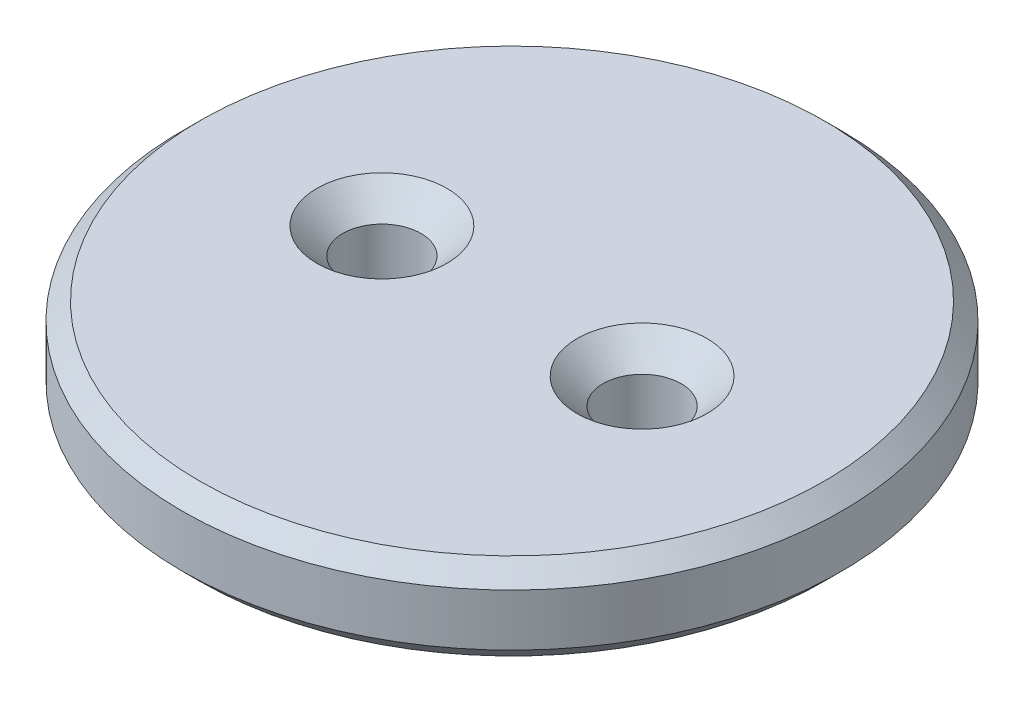
ISO-10303-21;
HEADER;
FILE_DESCRIPTION(('STEP AP214'),'2;1');
FILE_NAME('part.step','',(''),(''),'','','');
FILE_SCHEMA(('AUTOMOTIVE_DESIGN { 1 0 10303 214 1 1 1 1 }'));
ENDSEC;
DATA;
#1=APPLICATION_CONTEXT('core data for automotive mechanical design processes');
#2=APPLICATION_PROTOCOL_DEFINITION('international standard','automotive_design',2000,#1);
#3=PRODUCT_CONTEXT('',#1,'mechanical');
#4=PRODUCT('Part','Part','',(#3));
#5=PRODUCT_RELATED_PRODUCT_CATEGORY('part','',(#4));
#6=PRODUCT_DEFINITION_FORMATION('','',#4);
#7=PRODUCT_DEFINITION_CONTEXT('part definition',#1,'design');
#8=PRODUCT_DEFINITION('design','',#6,#7);
#9=PRODUCT_DEFINITION_SHAPE('','',#8);
#10=(LENGTH_UNIT() NAMED_UNIT(*) SI_UNIT(.MILLI.,.METRE.));
#11=(NAMED_UNIT(*) PLANE_ANGLE_UNIT() SI_UNIT($,.RADIAN.));
#12=(NAMED_UNIT(*) SI_UNIT($,.STERADIAN.) SOLID_ANGLE_UNIT());
#13=UNCERTAINTY_MEASURE_WITH_UNIT(LENGTH_MEASURE(1.E-05),#10,'distance_accuracy_value','');
#14=(GEOMETRIC_REPRESENTATION_CONTEXT(3) GLOBAL_UNCERTAINTY_ASSIGNED_CONTEXT((#13)) GLOBAL_UNIT_ASSIGNED_CONTEXT((#10,
#11,#12)) REPRESENTATION_CONTEXT('',''));
#15=CARTESIAN_POINT('',(0.,0.,0.));
#16=DIRECTION('',(0.,0.,1.));
#17=DIRECTION('',(1.,0.,0.));
#18=AXIS2_PLACEMENT_3D('',#15,#16,#17);
#19=CARTESIAN_POINT('',(0.,0.,0.));
#20=DIRECTION('',(0.,1.,0.));
#21=DIRECTION('',(0.,0.,1.));
#22=AXIS2_PLACEMENT_3D('',#19,#20,#21);
#23=PLANE('',#22);
#24=CARTESIAN_POINT('',(0.,0.,0.));
#25=DIRECTION('',(0.,1.,0.));
#26=DIRECTION('',(0.,0.,1.));
#27=AXIS2_PLACEMENT_3D('',#24,#25,#26);
#28=CIRCLE('',#27,18.);
#29=CARTESIAN_POINT('',(0.,0.,18.));
#30=VERTEX_POINT('',#29);
#31=EDGE_CURVE('E123',#30,#30,#28,.F.);
#32=ORIENTED_EDGE('',*,*,#31,.T.);
#33=EDGE_LOOP('',(#32));
#34=FACE_BOUND('',#33,.T.);
#35=DIRECTION('',(0.,0.,1.));
#36=VECTOR('',#35,1.);
#37=CARTESIAN_POINT('',(12.5,0.,-6.5));
#38=LINE('',#37,#36);
#39=CARTESIAN_POINT('',(12.5,0.,-6.5));
#40=VERTEX_POINT('',#39);
#41=CARTESIAN_POINT('',(12.5,0.,6.5));
#42=VERTEX_POINT('',#41);
#43=EDGE_CURVE('E107',#40,#42,#38,.T.);
#44=ORIENTED_EDGE('',*,*,#43,.F.);
#45=DIRECTION('',(1.,0.,0.));
#46=VECTOR('',#45,1.);
#47=CARTESIAN_POINT('',(-12.5,0.,-6.5));
#48=LINE('',#47,#46);
#49=CARTESIAN_POINT('',(-12.5,0.,-6.5));
#50=VERTEX_POINT('',#49);
#51=EDGE_CURVE('E104',#50,#40,#48,.T.);
#52=ORIENTED_EDGE('',*,*,#51,.F.);
#53=DIRECTION('',(0.,0.,-1.));
#54=VECTOR('',#53,1.);
#55=CARTESIAN_POINT('',(-12.5,0.,-6.5));
#56=LINE('',#55,#54);
#57=CARTESIAN_POINT('',(-12.5,0.,6.5));
#58=VERTEX_POINT('',#57);
#59=EDGE_CURVE('E64',#58,#50,#56,.T.);
#60=ORIENTED_EDGE('',*,*,#59,.F.);
#61=DIRECTION('',(-1.,0.,0.));
#62=VECTOR('',#61,1.);
#63=CARTESIAN_POINT('',(-12.5,0.,6.5));
#64=LINE('',#63,#62);
#65=EDGE_CURVE('E59',#42,#58,#64,.T.);
#66=ORIENTED_EDGE('',*,*,#65,.F.);
#67=EDGE_LOOP('',(#44,#52,#60,#66));
#68=FACE_BOUND('',#67,.T.);
#69=ADVANCED_FACE('F42',(#34,#68),#23,.F.);
#70=CARTESIAN_POINT('',(0.,5.,0.));
#71=DIRECTION('',(0.,-1.,0.));
#72=DIRECTION('',(0.,0.,-1.));
#73=AXIS2_PLACEMENT_3D('',#70,#71,#72);
#74=CYLINDRICAL_SURFACE('',#73,19.);
#75=CARTESIAN_POINT('',(0.,1.00000000000001,0.));
#76=DIRECTION('',(0.,1.,0.));
#77=DIRECTION('',(0.,0.,1.));
#78=AXIS2_PLACEMENT_3D('',#75,#76,#77);
#79=CIRCLE('',#78,19.);
#80=CARTESIAN_POINT('',(0.,1.00000000000001,19.));
#81=VERTEX_POINT('',#80);
#82=EDGE_CURVE('E114',#81,#81,#79,.T.);
#83=ORIENTED_EDGE('',*,*,#82,.T.);
#84=EDGE_LOOP('',(#83));
#85=FACE_BOUND('',#84,.T.);
#86=CARTESIAN_POINT('',(0.,4.,0.));
#87=DIRECTION('',(0.,1.,0.));
#88=DIRECTION('',(0.,0.,1.));
#89=AXIS2_PLACEMENT_3D('',#86,#87,#88);
#90=CIRCLE('',#89,19.);
#91=CARTESIAN_POINT('',(0.,4.,19.));
#92=VERTEX_POINT('',#91);
#93=EDGE_CURVE('E109',#92,#92,#90,.F.);
#94=ORIENTED_EDGE('',*,*,#93,.T.);
#95=EDGE_LOOP('',(#94));
#96=FACE_BOUND('',#95,.T.);
#97=ADVANCED_FACE('F198',(#85,#96),#74,.T.);
#98=CARTESIAN_POINT('',(0.,5.,0.));
#99=DIRECTION('',(0.,1.,0.));
#100=DIRECTION('',(0.,0.,1.));
#101=AXIS2_PLACEMENT_3D('',#98,#99,#100);
#102=PLANE('',#101);
#103=CARTESIAN_POINT('',(7.5,5.,0.));
#104=DIRECTION('',(0.,1.,0.));
#105=DIRECTION('',(0.,0.,1.));
#106=AXIS2_PLACEMENT_3D('',#103,#104,#105);
#107=CIRCLE('',#106,3.75);
#108=CARTESIAN_POINT('',(7.5,5.,3.75));
#109=VERTEX_POINT('',#108);
#110=EDGE_CURVE('E52',#109,#109,#107,.F.);
#111=ORIENTED_EDGE('',*,*,#110,.T.);
#112=EDGE_LOOP('',(#111));
#113=FACE_BOUND('',#112,.T.);
#114=CARTESIAN_POINT('',(-7.5,5.,0.));
#115=DIRECTION('',(0.,1.,0.));
#116=DIRECTION('',(0.,0.,1.));
#117=AXIS2_PLACEMENT_3D('',#114,#115,#116);
#118=CIRCLE('',#117,3.75);
#119=CARTESIAN_POINT('',(-7.5,5.,3.75));
#120=VERTEX_POINT('',#119);
#121=EDGE_CURVE('E135',#120,#120,#118,.F.);
#122=ORIENTED_EDGE('',*,*,#121,.T.);
#123=EDGE_LOOP('',(#122));
#124=FACE_BOUND('',#123,.T.);
#125=CARTESIAN_POINT('',(0.,5.,0.));
#126=DIRECTION('',(0.,1.,0.));
#127=DIRECTION('',(0.,0.,1.));
#128=AXIS2_PLACEMENT_3D('',#125,#126,#127);
#129=CIRCLE('',#128,18.);
#130=CARTESIAN_POINT('',(0.,5.,18.));
#131=VERTEX_POINT('',#130);
#132=EDGE_CURVE('E127',#131,#131,#129,.T.);
#133=ORIENTED_EDGE('',*,*,#132,.T.);
#134=EDGE_LOOP('',(#133));
#135=FACE_BOUND('',#134,.T.);
#136=ADVANCED_FACE('F142',(#113,#124,#135),#102,.T.);
#137=CARTESIAN_POINT('',(0.,1.00000000000001,0.));
#138=DIRECTION('',(0.,1.,0.));
#139=DIRECTION('',(0.,0.,1.));
#140=AXIS2_PLACEMENT_3D('',#137,#138,#139);
#141=CONICAL_SURFACE('',#140,19.,0.78539816339745);
#142=ORIENTED_EDGE('',*,*,#31,.F.);
#143=EDGE_LOOP('',(#142));
#144=FACE_BOUND('',#143,.T.);
#145=ORIENTED_EDGE('',*,*,#82,.F.);
#146=EDGE_LOOP('',(#145));
#147=FACE_BOUND('',#146,.T.);
#148=ADVANCED_FACE('F209',(#144,#147),#141,.T.);
#149=CARTESIAN_POINT('',(0.,5.,0.));
#150=DIRECTION('',(0.,-1.,0.));
#151=DIRECTION('',(0.,0.,-1.));
#152=AXIS2_PLACEMENT_3D('',#149,#150,#151);
#153=CONICAL_SURFACE('',#152,18.,0.78539816339745);
#154=ORIENTED_EDGE('',*,*,#93,.F.);
#155=EDGE_LOOP('',(#154));
#156=FACE_BOUND('',#155,.T.);
#157=ORIENTED_EDGE('',*,*,#132,.F.);
#158=EDGE_LOOP('',(#157));
#159=FACE_BOUND('',#158,.T.);
#160=ADVANCED_FACE('F154',(#156,#159),#153,.T.);
#161=CARTESIAN_POINT('',(7.5,0.,0.));
#162=DIRECTION('',(0.,1.,0.));
#163=DIRECTION('',(0.,0.,1.));
#164=AXIS2_PLACEMENT_3D('',#161,#162,#163);
#165=CYLINDRICAL_SURFACE('',#164,2.25);
#166=CARTESIAN_POINT('',(7.5,3.5,0.));
#167=DIRECTION('',(0.,1.,0.));
#168=DIRECTION('',(0.,0.,1.));
#169=AXIS2_PLACEMENT_3D('',#166,#167,#168);
#170=CIRCLE('',#169,2.25);
#171=CARTESIAN_POINT('',(7.5,3.5,2.25));
#172=VERTEX_POINT('',#171);
#173=EDGE_CURVE('E131',#172,#172,#170,.T.);
#174=ORIENTED_EDGE('',*,*,#173,.T.);
#175=EDGE_LOOP('',(#174));
#176=FACE_BOUND('',#175,.T.);
#177=CARTESIAN_POINT('',(7.5,-2.,0.));
#178=DIRECTION('',(0.,1.,0.));
#179=DIRECTION('',(0.,0.,1.));
#180=AXIS2_PLACEMENT_3D('',#177,#178,#179);
#181=CIRCLE('',#180,2.25);
#182=CARTESIAN_POINT('',(7.5,-2.,2.25));
#183=VERTEX_POINT('',#182);
#184=EDGE_CURVE('E158',#183,#183,#181,.T.);
#185=ORIENTED_EDGE('',*,*,#184,.F.);
#186=EDGE_LOOP('',(#185));
#187=FACE_BOUND('',#186,.T.);
#188=ADVANCED_FACE('F151',(#176,#187),#165,.F.);
#189=CARTESIAN_POINT('',(-7.5,0.,0.));
#190=DIRECTION('',(0.,1.,0.));
#191=DIRECTION('',(0.,0.,1.));
#192=AXIS2_PLACEMENT_3D('',#189,#190,#191);
#193=CYLINDRICAL_SURFACE('',#192,2.25);
#194=CARTESIAN_POINT('',(-7.5,3.5,0.));
#195=DIRECTION('',(0.,1.,0.));
#196=DIRECTION('',(0.,0.,1.));
#197=AXIS2_PLACEMENT_3D('',#194,#195,#196);
#198=CIRCLE('',#197,2.25);
#199=CARTESIAN_POINT('',(-7.5,3.5,2.25));
#200=VERTEX_POINT('',#199);
#201=EDGE_CURVE('E12',#200,#200,#198,.T.);
#202=ORIENTED_EDGE('',*,*,#201,.T.);
#203=EDGE_LOOP('',(#202));
#204=FACE_BOUND('',#203,.T.);
#205=CARTESIAN_POINT('',(-7.5,-2.,0.));
#206=DIRECTION('',(0.,1.,0.));
#207=DIRECTION('',(0.,0.,1.));
#208=AXIS2_PLACEMENT_3D('',#205,#206,#207);
#209=CIRCLE('',#208,2.25);
#210=CARTESIAN_POINT('',(-7.5,-2.,2.25));
#211=VERTEX_POINT('',#210);
#212=EDGE_CURVE('E161',#211,#211,#209,.T.);
#213=ORIENTED_EDGE('',*,*,#212,.F.);
#214=EDGE_LOOP('',(#213));
#215=FACE_BOUND('',#214,.T.);
#216=ADVANCED_FACE('F148',(#204,#215),#193,.F.);
#217=CARTESIAN_POINT('',(7.5,3.5,0.));
#218=DIRECTION('',(0.,1.,0.));
#219=DIRECTION('',(0.,0.,1.));
#220=AXIS2_PLACEMENT_3D('',#217,#218,#219);
#221=CONICAL_SURFACE('',#220,2.25,0.78539816339745);
#222=CARTESIAN_POINT('',(7.5,5.,3.75));
#223=CARTESIAN_POINT('',(7.5,4.984375,3.734375));
#224=CARTESIAN_POINT('',(7.5,4.96875,3.71875));
#225=CARTESIAN_POINT('',(7.5,4.9375,3.6875));
#226=CARTESIAN_POINT('',(7.5,4.921875,3.671875));
#227=CARTESIAN_POINT('',(7.5,4.890625,3.640625));
#228=CARTESIAN_POINT('',(7.5,4.875,3.625));
#229=CARTESIAN_POINT('',(7.5,4.84375,3.59375));
#230=CARTESIAN_POINT('',(7.5,4.828125,3.578125));
#231=CARTESIAN_POINT('',(7.5,4.796875,3.546875));
#232=CARTESIAN_POINT('',(7.5,4.78125,3.53125));
#233=CARTESIAN_POINT('',(7.5,4.75,3.5));
#234=CARTESIAN_POINT('',(7.5,4.734375,3.484375));
#235=CARTESIAN_POINT('',(7.5,4.703125,3.453125));
#236=CARTESIAN_POINT('',(7.5,4.6875,3.4375));
#237=CARTESIAN_POINT('',(7.5,4.65625,3.40625));
#238=CARTESIAN_POINT('',(7.5,4.640625,3.390625));
#239=CARTESIAN_POINT('',(7.5,4.609375,3.359375));
#240=CARTESIAN_POINT('',(7.5,4.59375,3.34375));
#241=CARTESIAN_POINT('',(7.5,4.5625,3.3125));
#242=CARTESIAN_POINT('',(7.5,4.546875,3.296875));
#243=CARTESIAN_POINT('',(7.5,4.515625,3.265625));
#244=CARTESIAN_POINT('',(7.5,4.5,3.25));
#245=CARTESIAN_POINT('',(7.5,4.46875,3.21875));
#246=CARTESIAN_POINT('',(7.5,4.453125,3.203125));
#247=CARTESIAN_POINT('',(7.5,4.421875,3.171875));
#248=CARTESIAN_POINT('',(7.5,4.40625,3.15625));
#249=CARTESIAN_POINT('',(7.5,4.375,3.125));
#250=CARTESIAN_POINT('',(7.5,4.359375,3.109375));
#251=CARTESIAN_POINT('',(7.5,4.328125,3.078125));
#252=CARTESIAN_POINT('',(7.5,4.3125,3.0625));
#253=CARTESIAN_POINT('',(7.5,4.28125,3.03125));
#254=CARTESIAN_POINT('',(7.5,4.265625,3.015625));
#255=CARTESIAN_POINT('',(7.5,4.234375,2.984375));
#256=CARTESIAN_POINT('',(7.5,4.21875,2.96875));
#257=CARTESIAN_POINT('',(7.5,4.1875,2.9375));
#258=CARTESIAN_POINT('',(7.5,4.171875,2.921875));
#259=CARTESIAN_POINT('',(7.5,4.140625,2.890625));
#260=CARTESIAN_POINT('',(7.5,4.125,2.875));
#261=CARTESIAN_POINT('',(7.5,4.09375,2.84375));
#262=CARTESIAN_POINT('',(7.5,4.078125,2.828125));
#263=CARTESIAN_POINT('',(7.5,4.046875,2.796875));
#264=CARTESIAN_POINT('',(7.5,4.03125,2.78125));
#265=CARTESIAN_POINT('',(7.5,4.,2.75));
#266=CARTESIAN_POINT('',(7.5,3.984375,2.734375));
#267=CARTESIAN_POINT('',(7.5,3.953125,2.703125));
#268=CARTESIAN_POINT('',(7.5,3.9375,2.6875));
#269=CARTESIAN_POINT('',(7.5,3.90625,2.65625));
#270=CARTESIAN_POINT('',(7.5,3.890625,2.640625));
#271=CARTESIAN_POINT('',(7.5,3.859375,2.609375));
#272=CARTESIAN_POINT('',(7.5,3.84375,2.59375));
#273=CARTESIAN_POINT('',(7.5,3.8125,2.5625));
#274=CARTESIAN_POINT('',(7.5,3.796875,2.546875));
#275=CARTESIAN_POINT('',(7.5,3.765625,2.515625));
#276=CARTESIAN_POINT('',(7.5,3.75,2.5));
#277=CARTESIAN_POINT('',(7.5,3.71875,2.46875));
#278=CARTESIAN_POINT('',(7.5,3.703125,2.453125));
#279=CARTESIAN_POINT('',(7.5,3.671875,2.421875));
#280=CARTESIAN_POINT('',(7.5,3.65625,2.40625));
#281=CARTESIAN_POINT('',(7.5,3.625,2.375));
#282=CARTESIAN_POINT('',(7.5,3.609375,2.359375));
#283=CARTESIAN_POINT('',(7.5,3.578125,2.328125));
#284=CARTESIAN_POINT('',(7.5,3.5625,2.3125));
#285=CARTESIAN_POINT('',(7.5,3.53125,2.28125));
#286=CARTESIAN_POINT('',(7.5,3.515625,2.265625));
#287=CARTESIAN_POINT('',(7.5,3.5,2.25));
#288=B_SPLINE_CURVE_WITH_KNOTS('',3,(#222,#223,#224,#225,#226,#227,#228,#229,#230,#231,#232,
#233,#234,#235,#236,#237,#238,#239,#240,#241,#242,#243,#244,#245,#246,#247,#248,#249,#250,#251,
#252,#253,#254,#255,#256,#257,#258,#259,#260,#261,#262,#263,#264,#265,#266,#267,#268,#269,#270,
#271,#272,#273,#274,#275,#276,#277,#278,#279,#280,#281,#282,#283,#284,#285,#286,#287),
.UNSPECIFIED.,.F.,.F.,(4,2,2,2,2,2,2,2,2,2,2,2,2,2,2,2,2,2,2,2,2,2,2,2,2,2,2,2,2,2,2,2,4),(0.,
0.0662912607362389,0.132582521472478,0.198873782208717,0.265165042944956,0.331456303681194,
0.397747564417433,0.464038825153672,0.530330085889911,0.59662134662615,0.662912607362389,
0.729203868098628,0.795495128834867,0.861786389571105,0.928077650307344,0.994368911043583,
1.06066017177982,1.12695143251606,1.1932426932523,1.25953395398854,1.32582521472478,
1.39211647546102,1.45840773619725,1.52469899693349,1.59099025766973,1.65728151840597,
1.72357277914221,1.78986403987845,1.85615530061469,1.92244656135093,1.98873782208717,
2.0550290828234,2.12132034355964),.UNSPECIFIED.);
#289=EDGE_CURVE('BSEAM145',#109,#172,#288,.T.);
#290=ORIENTED_EDGE('',*,*,#110,.F.);
#291=ORIENTED_EDGE('',*,*,#173,.F.);
#292=ORIENTED_EDGE('',*,*,#289,.T.);
#293=ORIENTED_EDGE('',*,*,#289,.F.);
#294=EDGE_LOOP('',(#290,#292,#291,#293));
#295=FACE_BOUND('',#294,.T.);
#296=ADVANCED_FACE('F145',(#295),#221,.F.);
#297=CARTESIAN_POINT('',(-7.5,3.5,0.));
#298=DIRECTION('',(0.,1.,0.));
#299=DIRECTION('',(0.,0.,1.));
#300=AXIS2_PLACEMENT_3D('',#297,#298,#299);
#301=CONICAL_SURFACE('',#300,2.25,0.78539816339745);
#302=CARTESIAN_POINT('',(-7.5,5.,3.75));
#303=CARTESIAN_POINT('',(-7.5,4.984375,3.734375));
#304=CARTESIAN_POINT('',(-7.5,4.96875,3.71875));
#305=CARTESIAN_POINT('',(-7.5,4.9375,3.6875));
#306=CARTESIAN_POINT('',(-7.5,4.921875,3.671875));
#307=CARTESIAN_POINT('',(-7.5,4.890625,3.640625));
#308=CARTESIAN_POINT('',(-7.5,4.875,3.625));
#309=CARTESIAN_POINT('',(-7.5,4.84375,3.59375));
#310=CARTESIAN_POINT('',(-7.5,4.828125,3.578125));
#311=CARTESIAN_POINT('',(-7.5,4.796875,3.546875));
#312=CARTESIAN_POINT('',(-7.5,4.78125,3.53125));
#313=CARTESIAN_POINT('',(-7.5,4.75,3.5));
#314=CARTESIAN_POINT('',(-7.5,4.734375,3.484375));
#315=CARTESIAN_POINT('',(-7.5,4.703125,3.453125));
#316=CARTESIAN_POINT('',(-7.5,4.6875,3.4375));
#317=CARTESIAN_POINT('',(-7.5,4.65625,3.40625));
#318=CARTESIAN_POINT('',(-7.5,4.640625,3.390625));
#319=CARTESIAN_POINT('',(-7.5,4.609375,3.359375));
#320=CARTESIAN_POINT('',(-7.5,4.59375,3.34375));
#321=CARTESIAN_POINT('',(-7.5,4.5625,3.3125));
#322=CARTESIAN_POINT('',(-7.5,4.546875,3.296875));
#323=CARTESIAN_POINT('',(-7.5,4.515625,3.265625));
#324=CARTESIAN_POINT('',(-7.5,4.5,3.25));
#325=CARTESIAN_POINT('',(-7.5,4.46875,3.21875));
#326=CARTESIAN_POINT('',(-7.5,4.453125,3.203125));
#327=CARTESIAN_POINT('',(-7.5,4.421875,3.171875));
#328=CARTESIAN_POINT('',(-7.5,4.40625,3.15625));
#329=CARTESIAN_POINT('',(-7.5,4.375,3.125));
#330=CARTESIAN_POINT('',(-7.5,4.359375,3.109375));
#331=CARTESIAN_POINT('',(-7.5,4.328125,3.078125));
#332=CARTESIAN_POINT('',(-7.5,4.3125,3.0625));
#333=CARTESIAN_POINT('',(-7.5,4.28125,3.03125));
#334=CARTESIAN_POINT('',(-7.5,4.265625,3.015625));
#335=CARTESIAN_POINT('',(-7.5,4.234375,2.984375));
#336=CARTESIAN_POINT('',(-7.5,4.21875,2.96875));
#337=CARTESIAN_POINT('',(-7.5,4.1875,2.9375));
#338=CARTESIAN_POINT('',(-7.5,4.171875,2.921875));
#339=CARTESIAN_POINT('',(-7.5,4.140625,2.890625));
#340=CARTESIAN_POINT('',(-7.5,4.125,2.875));
#341=CARTESIAN_POINT('',(-7.5,4.09375,2.84375));
#342=CARTESIAN_POINT('',(-7.5,4.078125,2.828125));
#343=CARTESIAN_POINT('',(-7.5,4.046875,2.796875));
#344=CARTESIAN_POINT('',(-7.5,4.03125,2.78125));
#345=CARTESIAN_POINT('',(-7.5,4.,2.75));
#346=CARTESIAN_POINT('',(-7.5,3.984375,2.734375));
#347=CARTESIAN_POINT('',(-7.5,3.953125,2.703125));
#348=CARTESIAN_POINT('',(-7.5,3.9375,2.6875));
#349=CARTESIAN_POINT('',(-7.5,3.90625,2.65625));
#350=CARTESIAN_POINT('',(-7.5,3.890625,2.640625));
#351=CARTESIAN_POINT('',(-7.5,3.859375,2.609375));
#352=CARTESIAN_POINT('',(-7.5,3.84375,2.59375));
#353=CARTESIAN_POINT('',(-7.5,3.8125,2.5625));
#354=CARTESIAN_POINT('',(-7.5,3.796875,2.546875));
#355=CARTESIAN_POINT('',(-7.5,3.765625,2.515625));
#356=CARTESIAN_POINT('',(-7.5,3.75,2.5));
#357=CARTESIAN_POINT('',(-7.5,3.71875,2.46875));
#358=CARTESIAN_POINT('',(-7.5,3.703125,2.453125));
#359=CARTESIAN_POINT('',(-7.5,3.671875,2.421875));
#360=CARTESIAN_POINT('',(-7.5,3.65625,2.40625));
#361=CARTESIAN_POINT('',(-7.5,3.625,2.375));
#362=CARTESIAN_POINT('',(-7.5,3.609375,2.359375));
#363=CARTESIAN_POINT('',(-7.5,3.578125,2.328125));
#364=CARTESIAN_POINT('',(-7.5,3.5625,2.3125));
#365=CARTESIAN_POINT('',(-7.5,3.53125,2.28125));
#366=CARTESIAN_POINT('',(-7.5,3.515625,2.265625));
#367=CARTESIAN_POINT('',(-7.5,3.5,2.25));
#368=B_SPLINE_CURVE_WITH_KNOTS('',3,(#302,#303,#304,#305,#306,#307,#308,#309,#310,#311,#312,
#313,#314,#315,#316,#317,#318,#319,#320,#321,#322,#323,#324,#325,#326,#327,#328,#329,#330,#331,
#332,#333,#334,#335,#336,#337,#338,#339,#340,#341,#342,#343,#344,#345,#346,#347,#348,#349,#350,
#351,#352,#353,#354,#355,#356,#357,#358,#359,#360,#361,#362,#363,#364,#365,#366,#367),
.UNSPECIFIED.,.F.,.F.,(4,2,2,2,2,2,2,2,2,2,2,2,2,2,2,2,2,2,2,2,2,2,2,2,2,2,2,2,2,2,2,2,4),(0.,
0.0662912607362389,0.132582521472478,0.198873782208717,0.265165042944956,0.331456303681194,
0.397747564417433,0.464038825153672,0.530330085889911,0.59662134662615,0.662912607362389,
0.729203868098628,0.795495128834867,0.861786389571105,0.928077650307344,0.994368911043583,
1.06066017177982,1.12695143251606,1.1932426932523,1.25953395398854,1.32582521472478,
1.39211647546102,1.45840773619725,1.52469899693349,1.59099025766973,1.65728151840597,
1.72357277914221,1.78986403987845,1.85615530061469,1.92244656135093,1.98873782208717,
2.0550290828234,2.12132034355964),.UNSPECIFIED.);
#369=EDGE_CURVE('BSEAM45',#120,#200,#368,.T.);
#370=ORIENTED_EDGE('',*,*,#121,.F.);
#371=ORIENTED_EDGE('',*,*,#201,.F.);
#372=ORIENTED_EDGE('',*,*,#369,.T.);
#373=ORIENTED_EDGE('',*,*,#369,.F.);
#374=EDGE_LOOP('',(#370,#372,#371,#373));
#375=FACE_BOUND('',#374,.T.);
#376=ADVANCED_FACE('F45',(#375),#301,.F.);
#377=CARTESIAN_POINT('',(12.5,-2.,-6.5));
#378=DIRECTION('',(-1.,0.,0.));
#379=DIRECTION('',(0.,0.,1.));
#380=AXIS2_PLACEMENT_3D('',#377,#378,#379);
#381=PLANE('',#380);
#382=ORIENTED_EDGE('',*,*,#43,.T.);
#383=DIRECTION('',(0.,1.,0.));
#384=VECTOR('',#383,1.);
#385=CARTESIAN_POINT('',(12.5,-2.,6.5));
#386=LINE('',#385,#384);
#387=CARTESIAN_POINT('',(12.5,-2.,6.5));
#388=VERTEX_POINT('',#387);
#389=EDGE_CURVE('E86',#388,#42,#386,.T.);
#390=ORIENTED_EDGE('',*,*,#389,.F.);
#391=DIRECTION('',(0.,0.,1.));
#392=VECTOR('',#391,1.);
#393=CARTESIAN_POINT('',(12.5,-2.,-6.5));
#394=LINE('',#393,#392);
#395=CARTESIAN_POINT('',(12.5,-2.,-6.5));
#396=VERTEX_POINT('',#395);
#397=EDGE_CURVE('E94',#396,#388,#394,.T.);
#398=ORIENTED_EDGE('',*,*,#397,.F.);
#399=DIRECTION('',(0.,1.,0.));
#400=VECTOR('',#399,1.);
#401=CARTESIAN_POINT('',(12.5,-2.,-6.5));
#402=LINE('',#401,#400);
#403=EDGE_CURVE('E172',#396,#40,#402,.T.);
#404=ORIENTED_EDGE('',*,*,#403,.T.);
#405=EDGE_LOOP('',(#382,#390,#398,#404));
#406=FACE_BOUND('',#405,.T.);
#407=ADVANCED_FACE('F106',(#406),#381,.F.);
#408=CARTESIAN_POINT('',(-12.5,-2.,6.5));
#409=DIRECTION('',(0.,0.,-1.));
#410=DIRECTION('',(-1.,0.,0.));
#411=AXIS2_PLACEMENT_3D('',#408,#409,#410);
#412=PLANE('',#411);
#413=ORIENTED_EDGE('',*,*,#65,.T.);
#414=DIRECTION('',(0.,1.,0.));
#415=VECTOR('',#414,1.);
#416=CARTESIAN_POINT('',(-12.5,-2.,6.5));
#417=LINE('',#416,#415);
#418=CARTESIAN_POINT('',(-12.5,-2.,6.5));
#419=VERTEX_POINT('',#418);
#420=EDGE_CURVE('E89',#419,#58,#417,.T.);
#421=ORIENTED_EDGE('',*,*,#420,.F.);
#422=DIRECTION('',(-1.,0.,0.));
#423=VECTOR('',#422,1.);
#424=CARTESIAN_POINT('',(-12.5,-2.,6.5));
#425=LINE('',#424,#423);
#426=EDGE_CURVE('E82',#388,#419,#425,.T.);
#427=ORIENTED_EDGE('',*,*,#426,.F.);
#428=ORIENTED_EDGE('',*,*,#389,.T.);
#429=EDGE_LOOP('',(#413,#421,#427,#428));
#430=FACE_BOUND('',#429,.T.);
#431=ADVANCED_FACE('F84',(#430),#412,.F.);
#432=CARTESIAN_POINT('',(-12.5,-2.,-6.5));
#433=DIRECTION('',(1.,0.,0.));
#434=DIRECTION('',(0.,0.,-1.));
#435=AXIS2_PLACEMENT_3D('',#432,#433,#434);
#436=PLANE('',#435);
#437=ORIENTED_EDGE('',*,*,#59,.T.);
#438=DIRECTION('',(0.,1.,0.));
#439=VECTOR('',#438,1.);
#440=CARTESIAN_POINT('',(-12.5,-2.,-6.5));
#441=LINE('',#440,#439);
#442=CARTESIAN_POINT('',(-12.5,-2.,-6.5));
#443=VERTEX_POINT('',#442);
#444=EDGE_CURVE('E116',#443,#50,#441,.T.);
#445=ORIENTED_EDGE('',*,*,#444,.F.);
#446=DIRECTION('',(0.,0.,-1.));
#447=VECTOR('',#446,1.);
#448=CARTESIAN_POINT('',(-12.5,-2.,-6.5));
#449=LINE('',#448,#447);
#450=EDGE_CURVE('E93',#419,#443,#449,.T.);
#451=ORIENTED_EDGE('',*,*,#450,.F.);
#452=ORIENTED_EDGE('',*,*,#420,.T.);
#453=EDGE_LOOP('',(#437,#445,#451,#452));
#454=FACE_BOUND('',#453,.T.);
#455=ADVANCED_FACE('F188',(#454),#436,.F.);
#456=CARTESIAN_POINT('',(-12.5,-2.,-6.5));
#457=DIRECTION('',(0.,0.,1.));
#458=DIRECTION('',(1.,0.,0.));
#459=AXIS2_PLACEMENT_3D('',#456,#457,#458);
#460=PLANE('',#459);
#461=ORIENTED_EDGE('',*,*,#51,.T.);
#462=ORIENTED_EDGE('',*,*,#403,.F.);
#463=DIRECTION('',(1.,0.,0.));
#464=VECTOR('',#463,1.);
#465=CARTESIAN_POINT('',(-12.5,-2.,-6.5));
#466=LINE('',#465,#464);
#467=EDGE_CURVE('E99',#443,#396,#466,.T.);
#468=ORIENTED_EDGE('',*,*,#467,.F.);
#469=ORIENTED_EDGE('',*,*,#444,.T.);
#470=EDGE_LOOP('',(#461,#462,#468,#469));
#471=FACE_BOUND('',#470,.T.);
#472=ADVANCED_FACE('F186',(#471),#460,.F.);
#473=CARTESIAN_POINT('',(0.,-2.,0.));
#474=DIRECTION('',(0.,1.,0.));
#475=DIRECTION('',(0.,0.,1.));
#476=AXIS2_PLACEMENT_3D('',#473,#474,#475);
#477=PLANE('',#476);
#478=ORIENTED_EDGE('',*,*,#184,.T.);
#479=EDGE_LOOP('',(#478));
#480=FACE_BOUND('',#479,.T.);
#481=ORIENTED_EDGE('',*,*,#212,.T.);
#482=EDGE_LOOP('',(#481));
#483=FACE_BOUND('',#482,.T.);
#484=ORIENTED_EDGE('',*,*,#397,.T.);
#485=ORIENTED_EDGE('',*,*,#426,.T.);
#486=ORIENTED_EDGE('',*,*,#450,.T.);
#487=ORIENTED_EDGE('',*,*,#467,.T.);
#488=EDGE_LOOP('',(#484,#485,#486,#487));
#489=FACE_BOUND('',#488,.T.);
#490=ADVANCED_FACE('F97',(#480,#483,#489),#477,.F.);
#491=CLOSED_SHELL('',(#69,#97,#136,#148,#160,#188,#216,#296,#376,#407,#431,#455,#472,#490));
#492=MANIFOLD_SOLID_BREP('B2',#491);
#493=ADVANCED_BREP_SHAPE_REPRESENTATION('',(#18,#492),#14);
#494=SHAPE_DEFINITION_REPRESENTATION(#9,#493);
ENDSEC;
END-ISO-10303-21;
